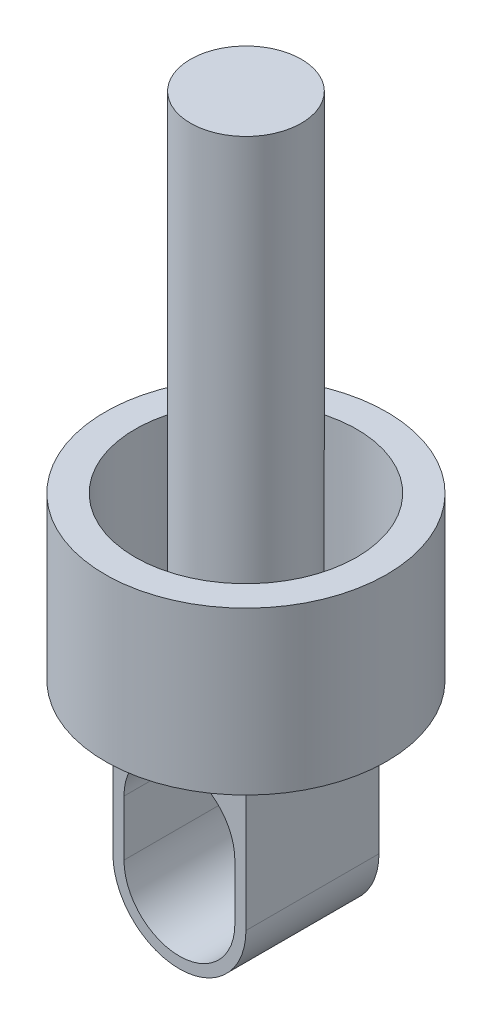
ISO-10303-21;
HEADER;
FILE_DESCRIPTION(('STEP AP214'),'2;1');
FILE_NAME('part.step','',(''),(''),'','','');
FILE_SCHEMA(('AUTOMOTIVE_DESIGN { 1 0 10303 214 1 1 1 1 }'));
ENDSEC;
DATA;
#1=APPLICATION_CONTEXT('core data for automotive mechanical design processes');
#2=APPLICATION_PROTOCOL_DEFINITION('international standard','automotive_design',2000,#1);
#3=PRODUCT_CONTEXT('',#1,'mechanical');
#4=PRODUCT('Part','Part','',(#3));
#5=PRODUCT_RELATED_PRODUCT_CATEGORY('part','',(#4));
#6=PRODUCT_DEFINITION_FORMATION('','',#4);
#7=PRODUCT_DEFINITION_CONTEXT('part definition',#1,'design');
#8=PRODUCT_DEFINITION('design','',#6,#7);
#9=PRODUCT_DEFINITION_SHAPE('','',#8);
#10=(LENGTH_UNIT() NAMED_UNIT(*) SI_UNIT(.MILLI.,.METRE.));
#11=(NAMED_UNIT(*) PLANE_ANGLE_UNIT() SI_UNIT($,.RADIAN.));
#12=(NAMED_UNIT(*) SI_UNIT($,.STERADIAN.) SOLID_ANGLE_UNIT());
#13=UNCERTAINTY_MEASURE_WITH_UNIT(LENGTH_MEASURE(1.E-05),#10,'distance_accuracy_value','');
#14=(GEOMETRIC_REPRESENTATION_CONTEXT(3) GLOBAL_UNCERTAINTY_ASSIGNED_CONTEXT((#13)) GLOBAL_UNIT_ASSIGNED_CONTEXT((#10,
#11,#12)) REPRESENTATION_CONTEXT('',''));
#15=CARTESIAN_POINT('',(0.,0.,0.));
#16=DIRECTION('',(0.,0.,1.));
#17=DIRECTION('',(1.,0.,0.));
#18=AXIS2_PLACEMENT_3D('',#15,#16,#17);
#19=CARTESIAN_POINT('',(0.,0.,0.));
#20=DIRECTION('',(0.,-1.,0.));
#21=DIRECTION('',(0.,0.,-1.));
#22=AXIS2_PLACEMENT_3D('',#19,#20,#21);
#23=PLANE('',#22);
#24=CARTESIAN_POINT('',(0.,0.,0.));
#25=DIRECTION('',(0.,-1.,0.));
#26=DIRECTION('',(0.,0.,-1.));
#27=AXIS2_PLACEMENT_3D('',#24,#25,#26);
#28=CIRCLE('',#27,50.);
#29=CARTESIAN_POINT('',(0.,0.,-50.));
#30=VERTEX_POINT('',#29);
#31=EDGE_CURVE('E13',#30,#30,#28,.F.);
#32=ORIENTED_EDGE('',*,*,#31,.F.);
#33=EDGE_LOOP('',(#32));
#34=FACE_BOUND('',#33,.T.);
#35=ADVANCED_FACE('F62',(#34),#23,.T.);
#36=OPEN_SHELL('',(#35));
#37=SHELL_BASED_SURFACE_MODEL('B2',(#36));
#38=CARTESIAN_POINT('',(0.,-67.8,-30.));
#39=DIRECTION('',(0.,0.,-1.));
#40=DIRECTION('',(-1.,0.,0.));
#41=AXIS2_PLACEMENT_3D('',#38,#39,#40);
#42=CYLINDRICAL_SURFACE('',#41,30.);
#43=DIRECTION('',(0.,0.,1.));
#44=VECTOR('',#43,1.);
#45=CARTESIAN_POINT('',(-30.,-67.8,-30.));
#46=LINE('',#45,#44);
#47=CARTESIAN_POINT('',(-30.,-67.8,-30.));
#48=VERTEX_POINT('',#47);
#49=CARTESIAN_POINT('',(-30.,-67.8,30.));
#50=VERTEX_POINT('',#49);
#51=EDGE_CURVE('E194',#48,#50,#46,.T.);
#52=ORIENTED_EDGE('',*,*,#51,.F.);
#53=CARTESIAN_POINT('',(0.,-67.8,-30.));
#54=DIRECTION('',(0.,0.,1.));
#55=DIRECTION('',(1.,0.,0.));
#56=AXIS2_PLACEMENT_3D('',#53,#54,#55);
#57=CIRCLE('',#56,30.);
#58=CARTESIAN_POINT('',(30.,-67.8,-30.));
#59=VERTEX_POINT('',#58);
#60=EDGE_CURVE('E103',#59,#48,#57,.F.);
#61=ORIENTED_EDGE('',*,*,#60,.F.);
#62=DIRECTION('',(0.,0.,1.));
#63=VECTOR('',#62,1.);
#64=CARTESIAN_POINT('',(30.,-67.8,-30.));
#65=LINE('',#64,#63);
#66=CARTESIAN_POINT('',(30.,-67.8,30.));
#67=VERTEX_POINT('',#66);
#68=EDGE_CURVE('E198',#67,#59,#65,.F.);
#69=ORIENTED_EDGE('',*,*,#68,.F.);
#70=CARTESIAN_POINT('',(0.,-67.8,30.));
#71=DIRECTION('',(0.,0.,-1.));
#72=DIRECTION('',(-1.,0.,0.));
#73=AXIS2_PLACEMENT_3D('',#70,#71,#72);
#74=CIRCLE('',#73,30.);
#75=EDGE_CURVE('E60',#50,#67,#74,.F.);
#76=ORIENTED_EDGE('',*,*,#75,.F.);
#77=EDGE_LOOP('',(#52,#61,#69,#76));
#78=FACE_BOUND('',#77,.T.);
#79=ADVANCED_FACE('F95',(#78),#42,.T.);
#80=CARTESIAN_POINT('',(-30.,-97.8,30.));
#81=DIRECTION('',(0.,0.,-1.));
#82=DIRECTION('',(-1.,0.,0.));
#83=AXIS2_PLACEMENT_3D('',#80,#81,#82);
#84=PLANE('',#83);
#85=DIRECTION('',(0.,1.,0.));
#86=VECTOR('',#85,1.);
#87=CARTESIAN_POINT('',(-30.,-97.8,30.));
#88=LINE('',#87,#86);
#89=CARTESIAN_POINT('',(-30.,0.,30.));
#90=VERTEX_POINT('',#89);
#91=EDGE_CURVE('E215',#50,#90,#88,.T.);
#92=ORIENTED_EDGE('',*,*,#91,.F.);
#93=ORIENTED_EDGE('',*,*,#75,.T.);
#94=DIRECTION('',(0.,1.,0.));
#95=VECTOR('',#94,1.);
#96=CARTESIAN_POINT('',(30.,-97.8,30.));
#97=LINE('',#96,#95);
#98=CARTESIAN_POINT('',(30.,0.,30.));
#99=VERTEX_POINT('',#98);
#100=EDGE_CURVE('E220',#67,#99,#97,.T.);
#101=ORIENTED_EDGE('',*,*,#100,.T.);
#102=DIRECTION('',(-1.,0.,0.));
#103=VECTOR('',#102,1.);
#104=CARTESIAN_POINT('',(-30.,0.,30.));
#105=LINE('',#104,#103);
#106=EDGE_CURVE('E373',#99,#90,#105,.T.);
#107=ORIENTED_EDGE('',*,*,#106,.T.);
#108=EDGE_LOOP('',(#92,#93,#101,#107));
#109=FACE_BOUND('',#108,.T.);
#110=CARTESIAN_POINT('',(0.,-42.8,29.9999999999999));
#111=DIRECTION('',(0.,0.,-1.));
#112=DIRECTION('',(-1.,0.,0.));
#113=AXIS2_PLACEMENT_3D('',#110,#111,#112);
#114=CIRCLE('',#113,25.);
#115=CARTESIAN_POINT('',(25.,-42.8,29.9999999999999));
#116=VERTEX_POINT('',#115);
#117=CARTESIAN_POINT('',(-25.,-42.8,29.9999999999999));
#118=VERTEX_POINT('',#117);
#119=EDGE_CURVE('E352',#116,#118,#114,.F.);
#120=ORIENTED_EDGE('',*,*,#119,.F.);
#121=DIRECTION('',(0.,1.,0.));
#122=VECTOR('',#121,1.);
#123=CARTESIAN_POINT('',(25.,-97.8,30.));
#124=LINE('',#123,#122);
#125=CARTESIAN_POINT('',(25.,-67.8,30.));
#126=VERTEX_POINT('',#125);
#127=EDGE_CURVE('E361',#126,#116,#124,.T.);
#128=ORIENTED_EDGE('',*,*,#127,.F.);
#129=CARTESIAN_POINT('',(0.,-67.8,30.));
#130=DIRECTION('',(0.,0.,-1.));
#131=DIRECTION('',(-1.,0.,0.));
#132=AXIS2_PLACEMENT_3D('',#129,#130,#131);
#133=CIRCLE('',#132,25.);
#134=CARTESIAN_POINT('',(-25.,-67.8,30.));
#135=VERTEX_POINT('',#134);
#136=EDGE_CURVE('E176',#135,#126,#133,.F.);
#137=ORIENTED_EDGE('',*,*,#136,.F.);
#138=DIRECTION('',(0.,-1.,0.));
#139=VECTOR('',#138,1.);
#140=CARTESIAN_POINT('',(-25.,-97.8,30.));
#141=LINE('',#140,#139);
#142=EDGE_CURVE('E358',#118,#135,#141,.T.);
#143=ORIENTED_EDGE('',*,*,#142,.F.);
#144=EDGE_LOOP('',(#120,#128,#137,#143));
#145=FACE_BOUND('',#144,.T.);
#146=ADVANCED_FACE('F259',(#109,#145),#84,.F.);
#147=CARTESIAN_POINT('',(-29.9999999999999,-97.8,-30.));
#148=DIRECTION('',(0.,0.,1.));
#149=DIRECTION('',(1.,0.,0.));
#150=AXIS2_PLACEMENT_3D('',#147,#148,#149);
#151=PLANE('',#150);
#152=DIRECTION('',(0.,1.,0.));
#153=VECTOR('',#152,1.);
#154=CARTESIAN_POINT('',(30.,-97.8,-30.));
#155=LINE('',#154,#153);
#156=CARTESIAN_POINT('',(30.,0.,-30.));
#157=VERTEX_POINT('',#156);
#158=EDGE_CURVE('E208',#59,#157,#155,.T.);
#159=ORIENTED_EDGE('',*,*,#158,.F.);
#160=ORIENTED_EDGE('',*,*,#60,.T.);
#161=DIRECTION('',(0.,1.,0.));
#162=VECTOR('',#161,1.);
#163=CARTESIAN_POINT('',(-29.9999999999999,-97.8,-30.));
#164=LINE('',#163,#162);
#165=CARTESIAN_POINT('',(-30.,0.,-30.));
#166=VERTEX_POINT('',#165);
#167=EDGE_CURVE('E206',#48,#166,#164,.T.);
#168=ORIENTED_EDGE('',*,*,#167,.T.);
#169=DIRECTION('',(1.,0.,0.));
#170=VECTOR('',#169,1.);
#171=CARTESIAN_POINT('',(-30.,0.,-30.));
#172=LINE('',#171,#170);
#173=EDGE_CURVE('E222',#166,#157,#172,.T.);
#174=ORIENTED_EDGE('',*,*,#173,.T.);
#175=EDGE_LOOP('',(#159,#160,#168,#174));
#176=FACE_BOUND('',#175,.T.);
#177=CARTESIAN_POINT('',(0.,-42.8,-30.));
#178=DIRECTION('',(0.,0.,1.));
#179=DIRECTION('',(1.,0.,0.));
#180=AXIS2_PLACEMENT_3D('',#177,#178,#179);
#181=CIRCLE('',#180,25.);
#182=CARTESIAN_POINT('',(-25.,-42.8,-30.));
#183=VERTEX_POINT('',#182);
#184=CARTESIAN_POINT('',(25.,-42.8,-30.));
#185=VERTEX_POINT('',#184);
#186=EDGE_CURVE('E188',#183,#185,#181,.F.);
#187=ORIENTED_EDGE('',*,*,#186,.F.);
#188=DIRECTION('',(0.,1.,0.));
#189=VECTOR('',#188,1.);
#190=CARTESIAN_POINT('',(-25.,-97.8,-30.));
#191=LINE('',#190,#189);
#192=CARTESIAN_POINT('',(-25.,-67.8,-30.));
#193=VERTEX_POINT('',#192);
#194=EDGE_CURVE('E183',#193,#183,#191,.T.);
#195=ORIENTED_EDGE('',*,*,#194,.F.);
#196=CARTESIAN_POINT('',(0.,-67.8,-30.));
#197=DIRECTION('',(0.,0.,1.));
#198=DIRECTION('',(1.,0.,0.));
#199=AXIS2_PLACEMENT_3D('',#196,#197,#198);
#200=CIRCLE('',#199,25.);
#201=CARTESIAN_POINT('',(25.,-67.8,-30.));
#202=VERTEX_POINT('',#201);
#203=EDGE_CURVE('E168',#202,#193,#200,.F.);
#204=ORIENTED_EDGE('',*,*,#203,.F.);
#205=DIRECTION('',(0.,-1.,0.));
#206=VECTOR('',#205,1.);
#207=CARTESIAN_POINT('',(25.,-97.8,-30.));
#208=LINE('',#207,#206);
#209=EDGE_CURVE('E156',#185,#202,#208,.T.);
#210=ORIENTED_EDGE('',*,*,#209,.F.);
#211=EDGE_LOOP('',(#187,#195,#204,#210));
#212=FACE_BOUND('',#211,.T.);
#213=ADVANCED_FACE('F182',(#176,#212),#151,.F.);
#214=CARTESIAN_POINT('',(0.,230.,0.));
#215=DIRECTION('',(0.,1.,0.));
#216=DIRECTION('',(-1.,0.,0.));
#217=AXIS2_PLACEMENT_3D('',#214,#215,#216);
#218=CYLINDRICAL_SURFACE('',#217,25.);
#219=CARTESIAN_POINT('',(0.,230.,0.));
#220=DIRECTION('',(0.,1.,0.));
#221=DIRECTION('',(-1.,0.,0.));
#222=AXIS2_PLACEMENT_3D('',#219,#220,#221);
#223=CIRCLE('',#222,25.);
#224=CARTESIAN_POINT('',(-25.0000000000001,230.,0.));
#225=VERTEX_POINT('',#224);
#226=EDGE_CURVE('E169',#225,#225,#223,.T.);
#227=ORIENTED_EDGE('',*,*,#226,.F.);
#228=EDGE_LOOP('',(#227));
#229=FACE_BOUND('',#228,.T.);
#230=CARTESIAN_POINT('',(0.,0.,0.));
#231=DIRECTION('',(0.,-1.,0.));
#232=DIRECTION('',(1.,0.,0.));
#233=AXIS2_PLACEMENT_3D('',#230,#231,#232);
#234=CIRCLE('',#233,25.);
#235=CARTESIAN_POINT('',(25.,0.,0.));
#236=VERTEX_POINT('',#235);
#237=EDGE_CURVE('E228',#236,#236,#234,.T.);
#238=ORIENTED_EDGE('',*,*,#237,.F.);
#239=EDGE_LOOP('',(#238));
#240=FACE_BOUND('',#239,.T.);
#241=ADVANCED_FACE('F238',(#229,#240),#218,.T.);
#242=CARTESIAN_POINT('',(0.,230.,0.));
#243=DIRECTION('',(0.,-1.,0.));
#244=DIRECTION('',(1.,0.,0.));
#245=AXIS2_PLACEMENT_3D('',#242,#243,#244);
#246=PLANE('',#245);
#247=ORIENTED_EDGE('',*,*,#226,.T.);
#248=EDGE_LOOP('',(#247));
#249=FACE_BOUND('',#248,.T.);
#250=ADVANCED_FACE('F236',(#249),#246,.F.);
#251=CARTESIAN_POINT('',(0.,0.,0.));
#252=DIRECTION('',(0.,-1.,0.));
#253=DIRECTION('',(1.,0.,0.));
#254=AXIS2_PLACEMENT_3D('',#251,#252,#253);
#255=PLANE('',#254);
#256=DIRECTION('',(0.,0.,1.));
#257=VECTOR('',#256,1.);
#258=CARTESIAN_POINT('',(30.,0.,30.));
#259=LINE('',#258,#257);
#260=EDGE_CURVE('E357',#157,#99,#259,.T.);
#261=ORIENTED_EDGE('',*,*,#260,.F.);
#262=ORIENTED_EDGE('',*,*,#173,.F.);
#263=DIRECTION('',(0.,0.,-1.));
#264=VECTOR('',#263,1.);
#265=CARTESIAN_POINT('',(-30.,0.,30.));
#266=LINE('',#265,#264);
#267=EDGE_CURVE('E212',#90,#166,#266,.T.);
#268=ORIENTED_EDGE('',*,*,#267,.F.);
#269=ORIENTED_EDGE('',*,*,#106,.F.);
#270=EDGE_LOOP('',(#261,#262,#268,#269));
#271=FACE_BOUND('',#270,.T.);
#272=ORIENTED_EDGE('',*,*,#237,.T.);
#273=EDGE_LOOP('',(#272));
#274=FACE_BOUND('',#273,.T.);
#275=ADVANCED_FACE('F243',(#271,#274),#255,.F.);
#276=CARTESIAN_POINT('',(30.,-97.8,30.));
#277=DIRECTION('',(-1.,0.,0.));
#278=DIRECTION('',(0.,-1.,0.));
#279=AXIS2_PLACEMENT_3D('',#276,#277,#278);
#280=PLANE('',#279);
#281=ORIENTED_EDGE('',*,*,#100,.F.);
#282=ORIENTED_EDGE('',*,*,#68,.T.);
#283=ORIENTED_EDGE('',*,*,#158,.T.);
#284=ORIENTED_EDGE('',*,*,#260,.T.);
#285=EDGE_LOOP('',(#281,#282,#283,#284));
#286=FACE_BOUND('',#285,.T.);
#287=ADVANCED_FACE('F245',(#286),#280,.F.);
#288=CARTESIAN_POINT('',(-30.,-97.8,30.));
#289=DIRECTION('',(1.,0.,0.));
#290=DIRECTION('',(0.,0.,-1.));
#291=AXIS2_PLACEMENT_3D('',#288,#289,#290);
#292=PLANE('',#291);
#293=ORIENTED_EDGE('',*,*,#167,.F.);
#294=ORIENTED_EDGE('',*,*,#51,.T.);
#295=ORIENTED_EDGE('',*,*,#91,.T.);
#296=ORIENTED_EDGE('',*,*,#267,.T.);
#297=EDGE_LOOP('',(#293,#294,#295,#296));
#298=FACE_BOUND('',#297,.T.);
#299=ADVANCED_FACE('F210',(#298),#292,.F.);
#300=CARTESIAN_POINT('',(0.,-42.8,97.8));
#301=DIRECTION('',(0.,0.,-1.));
#302=DIRECTION('',(-1.,0.,0.));
#303=AXIS2_PLACEMENT_3D('',#300,#301,#302);
#304=CYLINDRICAL_SURFACE('',#303,25.);
#305=ORIENTED_EDGE('',*,*,#119,.T.);
#306=DIRECTION('',(0.,0.,-1.));
#307=VECTOR('',#306,1.);
#308=CARTESIAN_POINT('',(-25.,-42.8,97.8));
#309=LINE('',#308,#307);
#310=EDGE_CURVE('E354',#118,#183,#309,.T.);
#311=ORIENTED_EDGE('',*,*,#310,.T.);
#312=ORIENTED_EDGE('',*,*,#186,.T.);
#313=DIRECTION('',(0.,0.,-1.));
#314=VECTOR('',#313,1.);
#315=CARTESIAN_POINT('',(25.,-42.8,97.8));
#316=LINE('',#315,#314);
#317=EDGE_CURVE('E162',#116,#185,#316,.T.);
#318=ORIENTED_EDGE('',*,*,#317,.F.);
#319=EDGE_LOOP('',(#305,#311,#312,#318));
#320=FACE_BOUND('',#319,.T.);
#321=ADVANCED_FACE('F270',(#320),#304,.F.);
#322=CARTESIAN_POINT('',(-25.,-42.8,97.8));
#323=DIRECTION('',(1.,0.,0.));
#324=DIRECTION('',(0.,0.,-1.));
#325=AXIS2_PLACEMENT_3D('',#322,#323,#324);
#326=PLANE('',#325);
#327=ORIENTED_EDGE('',*,*,#142,.T.);
#328=DIRECTION('',(0.,0.,-1.));
#329=VECTOR('',#328,1.);
#330=CARTESIAN_POINT('',(-25.,-67.8,97.8));
#331=LINE('',#330,#329);
#332=EDGE_CURVE('E179',#135,#193,#331,.T.);
#333=ORIENTED_EDGE('',*,*,#332,.T.);
#334=ORIENTED_EDGE('',*,*,#194,.T.);
#335=ORIENTED_EDGE('',*,*,#310,.F.);
#336=EDGE_LOOP('',(#327,#333,#334,#335));
#337=FACE_BOUND('',#336,.T.);
#338=ADVANCED_FACE('F274',(#337),#326,.T.);
#339=CARTESIAN_POINT('',(0.,-67.8,97.8));
#340=DIRECTION('',(0.,0.,-1.));
#341=DIRECTION('',(-1.,0.,0.));
#342=AXIS2_PLACEMENT_3D('',#339,#340,#341);
#343=CYLINDRICAL_SURFACE('',#342,25.);
#344=ORIENTED_EDGE('',*,*,#136,.T.);
#345=DIRECTION('',(0.,0.,-1.));
#346=VECTOR('',#345,1.);
#347=CARTESIAN_POINT('',(25.,-67.8,97.8));
#348=LINE('',#347,#346);
#349=EDGE_CURVE('E159',#126,#202,#348,.T.);
#350=ORIENTED_EDGE('',*,*,#349,.T.);
#351=ORIENTED_EDGE('',*,*,#203,.T.);
#352=ORIENTED_EDGE('',*,*,#332,.F.);
#353=EDGE_LOOP('',(#344,#350,#351,#352));
#354=FACE_BOUND('',#353,.T.);
#355=ADVANCED_FACE('F172',(#354),#343,.F.);
#356=CARTESIAN_POINT('',(25.,-67.8,97.8));
#357=DIRECTION('',(-1.,0.,0.));
#358=DIRECTION('',(0.,0.,1.));
#359=AXIS2_PLACEMENT_3D('',#356,#357,#358);
#360=PLANE('',#359);
#361=ORIENTED_EDGE('',*,*,#127,.T.);
#362=ORIENTED_EDGE('',*,*,#317,.T.);
#363=ORIENTED_EDGE('',*,*,#209,.T.);
#364=ORIENTED_EDGE('',*,*,#349,.F.);
#365=EDGE_LOOP('',(#361,#362,#363,#364));
#366=FACE_BOUND('',#365,.T.);
#367=ADVANCED_FACE('F158',(#366),#360,.T.);
#368=CLOSED_SHELL('',(#79,#146,#213,#241,#250,#275,#287,#299,#321,#338,#355,#367));
#369=MANIFOLD_SOLID_BREP('B8',#368);
#370=CARTESIAN_POINT('',(0.,73.,-1.11022302462516E-13));
#371=DIRECTION('',(0.,-1.,0.));
#372=DIRECTION('',(1.,0.,0.));
#373=AXIS2_PLACEMENT_3D('',#370,#371,#372);
#374=PLANE('',#373);
#375=CARTESIAN_POINT('',(0.,73.,-1.11022302462516E-13));
#376=DIRECTION('',(0.,-1.,0.));
#377=DIRECTION('',(1.,0.,0.));
#378=AXIS2_PLACEMENT_3D('',#375,#376,#377);
#379=CIRCLE('',#378,50.);
#380=CARTESIAN_POINT('',(50.,73.,-1.11022302462516E-13));
#381=VERTEX_POINT('',#380);
#382=EDGE_CURVE('E429',#381,#381,#379,.T.);
#383=ORIENTED_EDGE('',*,*,#382,.T.);
#384=EDGE_LOOP('',(#383));
#385=FACE_BOUND('',#384,.T.);
#386=CARTESIAN_POINT('',(0.,73.,-1.11022302462516E-13));
#387=DIRECTION('',(0.,-1.,0.));
#388=DIRECTION('',(1.,0.,0.));
#389=AXIS2_PLACEMENT_3D('',#386,#387,#388);
#390=CIRCLE('',#389,63.5);
#391=CARTESIAN_POINT('',(63.4999999999999,73.,-1.11022302462516E-13));
#392=VERTEX_POINT('',#391);
#393=EDGE_CURVE('E94',#392,#392,#390,.T.);
#394=ORIENTED_EDGE('',*,*,#393,.F.);
#395=EDGE_LOOP('',(#394));
#396=FACE_BOUND('',#395,.T.);
#397=ADVANCED_FACE('F415',(#385,#396),#374,.F.);
#398=CARTESIAN_POINT('',(0.,73.,-1.11022302462516E-13));
#399=DIRECTION('',(0.,-1.,0.));
#400=DIRECTION('',(1.,0.,0.));
#401=AXIS2_PLACEMENT_3D('',#398,#399,#400);
#402=CYLINDRICAL_SURFACE('',#401,63.5);
#403=ORIENTED_EDGE('',*,*,#393,.T.);
#404=EDGE_LOOP('',(#403));
#405=FACE_BOUND('',#404,.T.);
#406=CARTESIAN_POINT('',(0.,0.,0.));
#407=DIRECTION('',(0.,-1.,0.));
#408=DIRECTION('',(1.,0.,0.));
#409=AXIS2_PLACEMENT_3D('',#406,#407,#408);
#410=CIRCLE('',#409,63.5);
#411=CARTESIAN_POINT('',(63.5,0.,0.));
#412=VERTEX_POINT('',#411);
#413=EDGE_CURVE('E419',#412,#412,#410,.T.);
#414=ORIENTED_EDGE('',*,*,#413,.F.);
#415=EDGE_LOOP('',(#414));
#416=FACE_BOUND('',#415,.T.);
#417=ADVANCED_FACE('F450',(#405,#416),#402,.T.);
#418=CARTESIAN_POINT('',(25.,0.,0.));
#419=DIRECTION('',(0.,1.,0.));
#420=DIRECTION('',(-1.,0.,0.));
#421=AXIS2_PLACEMENT_3D('',#418,#419,#420);
#422=PLANE('',#421);
#423=CARTESIAN_POINT('',(0.,0.,0.));
#424=DIRECTION('',(0.,1.,0.));
#425=DIRECTION('',(0.,0.,1.));
#426=AXIS2_PLACEMENT_3D('',#423,#424,#425);
#427=CIRCLE('',#426,50.);
#428=CARTESIAN_POINT('',(0.,0.,50.));
#429=VERTEX_POINT('',#428);
#430=EDGE_CURVE('E434',#429,#429,#427,.T.);
#431=ORIENTED_EDGE('',*,*,#430,.T.);
#432=EDGE_LOOP('',(#431));
#433=FACE_BOUND('',#432,.T.);
#434=ORIENTED_EDGE('',*,*,#413,.T.);
#435=EDGE_LOOP('',(#434));
#436=FACE_BOUND('',#435,.T.);
#437=ADVANCED_FACE('F417',(#433,#436),#422,.F.);
#438=CARTESIAN_POINT('',(0.,0.,0.));
#439=DIRECTION('',(0.,1.,0.));
#440=DIRECTION('',(-1.,0.,0.));
#441=AXIS2_PLACEMENT_3D('',#438,#439,#440);
#442=CYLINDRICAL_SURFACE('',#441,50.);
#443=ORIENTED_EDGE('',*,*,#430,.F.);
#444=EDGE_LOOP('',(#443));
#445=FACE_BOUND('',#444,.T.);
#446=ORIENTED_EDGE('',*,*,#382,.F.);
#447=EDGE_LOOP('',(#446));
#448=FACE_BOUND('',#447,.T.);
#449=ADVANCED_FACE('F442',(#445,#448),#442,.F.);
#450=CLOSED_SHELL('',(#397,#417,#437,#449));
#451=MANIFOLD_SOLID_BREP('B54',#450);
#452=ADVANCED_BREP_SHAPE_REPRESENTATION('',(#18,#369,#451),#14);
#453=MANIFOLD_SURFACE_SHAPE_REPRESENTATION('',(#18,#37),#14);
#454=SHAPE_REPRESENTATION('',(#18),#14);
#455=SHAPE_DEFINITION_REPRESENTATION(#9,#454);
#456=SHAPE_REPRESENTATION_RELATIONSHIP('','',#454,#452);
#457=SHAPE_REPRESENTATION_RELATIONSHIP('','',#454,#453);
ENDSEC;
END-ISO-10303-21;
